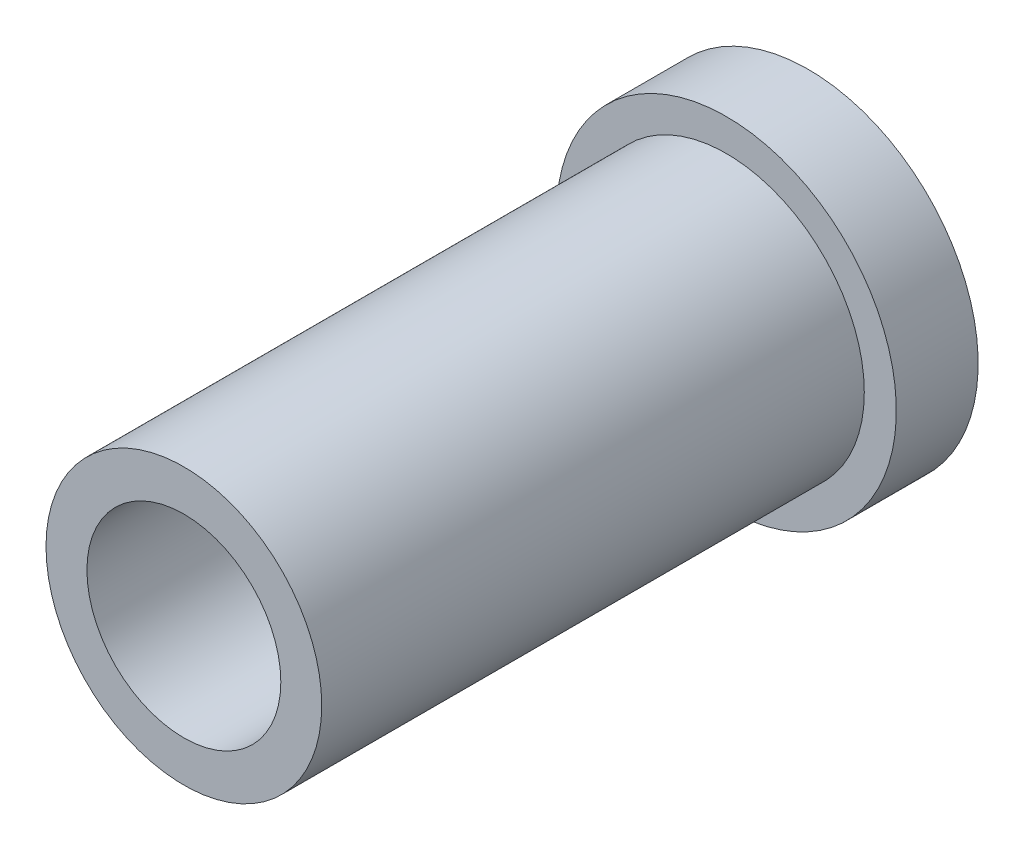
ISO-10303-21;
HEADER;
FILE_DESCRIPTION(('STEP AP214'),'2;1');
FILE_NAME('part.step','',(''),(''),'','','');
FILE_SCHEMA(('AUTOMOTIVE_DESIGN { 1 0 10303 214 1 1 1 1 }'));
ENDSEC;
DATA;
#1=APPLICATION_CONTEXT('core data for automotive mechanical design processes');
#2=APPLICATION_PROTOCOL_DEFINITION('international standard','automotive_design',2000,#1);
#3=PRODUCT_CONTEXT('',#1,'mechanical');
#4=PRODUCT('Part','Part','',(#3));
#5=PRODUCT_RELATED_PRODUCT_CATEGORY('part','',(#4));
#6=PRODUCT_DEFINITION_FORMATION('','',#4);
#7=PRODUCT_DEFINITION_CONTEXT('part definition',#1,'design');
#8=PRODUCT_DEFINITION('design','',#6,#7);
#9=PRODUCT_DEFINITION_SHAPE('','',#8);
#10=(LENGTH_UNIT() NAMED_UNIT(*) SI_UNIT(.MILLI.,.METRE.));
#11=(NAMED_UNIT(*) PLANE_ANGLE_UNIT() SI_UNIT($,.RADIAN.));
#12=(NAMED_UNIT(*) SI_UNIT($,.STERADIAN.) SOLID_ANGLE_UNIT());
#13=UNCERTAINTY_MEASURE_WITH_UNIT(LENGTH_MEASURE(1.E-05),#10,'distance_accuracy_value','');
#14=(GEOMETRIC_REPRESENTATION_CONTEXT(3) GLOBAL_UNCERTAINTY_ASSIGNED_CONTEXT((#13)) GLOBAL_UNIT_ASSIGNED_CONTEXT((#10,
#11,#12)) REPRESENTATION_CONTEXT('',''));
#15=CARTESIAN_POINT('',(0.,0.,0.));
#16=DIRECTION('',(0.,0.,1.));
#17=DIRECTION('',(1.,0.,0.));
#18=AXIS2_PLACEMENT_3D('',#15,#16,#17);
#19=CARTESIAN_POINT('',(0.,0.,-0.460000000000002));
#20=DIRECTION('',(0.,0.,-1.));
#21=DIRECTION('',(-1.,0.,0.));
#22=AXIS2_PLACEMENT_3D('',#19,#20,#21);
#23=CYLINDRICAL_SURFACE('',#22,0.545000000000001);
#24=CARTESIAN_POINT('',(0.,0.,-0.460000000000003));
#25=DIRECTION('',(0.,0.,-1.));
#26=DIRECTION('',(-1.,0.,0.));
#27=AXIS2_PLACEMENT_3D('',#24,#25,#26);
#28=CIRCLE('',#27,0.545000000000002);
#29=CARTESIAN_POINT('',(-0.545,0.,-0.460000000000003));
#30=VERTEX_POINT('',#29);
#31=EDGE_CURVE('E10',#30,#30,#28,.T.);
#32=ORIENTED_EDGE('',*,*,#31,.T.);
#33=EDGE_LOOP('',(#32));
#34=FACE_BOUND('',#33,.T.);
#35=CARTESIAN_POINT('',(0.,0.,3.05));
#36=DIRECTION('',(0.,0.,-1.));
#37=DIRECTION('',(-1.,0.,0.));
#38=AXIS2_PLACEMENT_3D('',#35,#36,#37);
#39=CIRCLE('',#38,0.545000000000001);
#40=CARTESIAN_POINT('',(-0.545,0.,3.05));
#41=VERTEX_POINT('',#40);
#42=EDGE_CURVE('E53',#41,#41,#39,.T.);
#43=ORIENTED_EDGE('',*,*,#42,.F.);
#44=EDGE_LOOP('',(#43));
#45=FACE_BOUND('',#44,.T.);
#46=ADVANCED_FACE('F31',(#34,#45),#23,.F.);
#47=CARTESIAN_POINT('',(-0.545,0.,-0.460000000000001));
#48=DIRECTION('',(0.,0.,-1.));
#49=DIRECTION('',(-1.,0.,0.));
#50=AXIS2_PLACEMENT_3D('',#47,#48,#49);
#51=PLANE('',#50);
#52=CARTESIAN_POINT('',(0.,0.,-0.46));
#53=DIRECTION('',(0.,0.,-1.));
#54=DIRECTION('',(-1.,0.,0.));
#55=AXIS2_PLACEMENT_3D('',#52,#53,#54);
#56=CIRCLE('',#55,0.955000000000003);
#57=CARTESIAN_POINT('',(-0.955000000000001,0.,-0.46));
#58=VERTEX_POINT('',#57);
#59=EDGE_CURVE('E37',#58,#58,#56,.T.);
#60=ORIENTED_EDGE('',*,*,#59,.T.);
#61=EDGE_LOOP('',(#60));
#62=FACE_BOUND('',#61,.T.);
#63=ORIENTED_EDGE('',*,*,#31,.F.);
#64=EDGE_LOOP('',(#63));
#65=FACE_BOUND('',#64,.T.);
#66=ADVANCED_FACE('F61',(#62,#65),#51,.T.);
#67=CARTESIAN_POINT('',(0.,0.,-0.460000000000002));
#68=DIRECTION('',(0.,0.,-1.));
#69=DIRECTION('',(-1.,0.,0.));
#70=AXIS2_PLACEMENT_3D('',#67,#68,#69);
#71=CYLINDRICAL_SURFACE('',#70,0.955000000000003);
#72=CARTESIAN_POINT('',(0.,0.,0.));
#73=DIRECTION('',(0.,0.,-1.));
#74=DIRECTION('',(-1.,0.,0.));
#75=AXIS2_PLACEMENT_3D('',#72,#73,#74);
#76=CIRCLE('',#75,0.955000000000003);
#77=CARTESIAN_POINT('',(-0.955000000000001,0.,0.));
#78=VERTEX_POINT('',#77);
#79=EDGE_CURVE('E41',#78,#78,#76,.T.);
#80=ORIENTED_EDGE('',*,*,#79,.T.);
#81=EDGE_LOOP('',(#80));
#82=FACE_BOUND('',#81,.T.);
#83=ORIENTED_EDGE('',*,*,#59,.F.);
#84=EDGE_LOOP('',(#83));
#85=FACE_BOUND('',#84,.T.);
#86=ADVANCED_FACE('F65',(#82,#85),#71,.T.);
#87=CARTESIAN_POINT('',(-0.955000000000001,0.,0.));
#88=DIRECTION('',(0.,0.,1.));
#89=DIRECTION('',(1.,0.,0.));
#90=AXIS2_PLACEMENT_3D('',#87,#88,#89);
#91=PLANE('',#90);
#92=CARTESIAN_POINT('',(0.,0.,0.));
#93=DIRECTION('',(0.,0.,-1.));
#94=DIRECTION('',(-1.,0.,0.));
#95=AXIS2_PLACEMENT_3D('',#92,#93,#94);
#96=CIRCLE('',#95,0.775000000000003);
#97=CARTESIAN_POINT('',(-0.775000000000001,0.,0.));
#98=VERTEX_POINT('',#97);
#99=EDGE_CURVE('E45',#98,#98,#96,.T.);
#100=ORIENTED_EDGE('',*,*,#99,.T.);
#101=EDGE_LOOP('',(#100));
#102=FACE_BOUND('',#101,.T.);
#103=ORIENTED_EDGE('',*,*,#79,.F.);
#104=EDGE_LOOP('',(#103));
#105=FACE_BOUND('',#104,.T.);
#106=ADVANCED_FACE('F69',(#102,#105),#91,.T.);
#107=CARTESIAN_POINT('',(0.,0.,-0.460000000000002));
#108=DIRECTION('',(0.,0.,-1.));
#109=DIRECTION('',(-1.,0.,0.));
#110=AXIS2_PLACEMENT_3D('',#107,#108,#109);
#111=CYLINDRICAL_SURFACE('',#110,0.775000000000002);
#112=CARTESIAN_POINT('',(0.,0.,3.05));
#113=DIRECTION('',(0.,0.,-1.));
#114=DIRECTION('',(-1.,0.,0.));
#115=AXIS2_PLACEMENT_3D('',#112,#113,#114);
#116=CIRCLE('',#115,0.775000000000002);
#117=CARTESIAN_POINT('',(-0.775000000000001,0.,3.05));
#118=VERTEX_POINT('',#117);
#119=EDGE_CURVE('E50',#118,#118,#116,.T.);
#120=ORIENTED_EDGE('',*,*,#119,.T.);
#121=EDGE_LOOP('',(#120));
#122=FACE_BOUND('',#121,.T.);
#123=ORIENTED_EDGE('',*,*,#99,.F.);
#124=EDGE_LOOP('',(#123));
#125=FACE_BOUND('',#124,.T.);
#126=ADVANCED_FACE('F76',(#122,#125),#111,.T.);
#127=CARTESIAN_POINT('',(-0.775000000000001,0.,3.05));
#128=DIRECTION('',(0.,0.,1.));
#129=DIRECTION('',(1.,0.,0.));
#130=AXIS2_PLACEMENT_3D('',#127,#128,#129);
#131=PLANE('',#130);
#132=ORIENTED_EDGE('',*,*,#42,.T.);
#133=EDGE_LOOP('',(#132));
#134=FACE_BOUND('',#133,.T.);
#135=ORIENTED_EDGE('',*,*,#119,.F.);
#136=EDGE_LOOP('',(#135));
#137=FACE_BOUND('',#136,.T.);
#138=ADVANCED_FACE('F57',(#134,#137),#131,.T.);
#139=CLOSED_SHELL('',(#46,#66,#86,#106,#126,#138));
#140=MANIFOLD_SOLID_BREP('B2',#139);
#141=ADVANCED_BREP_SHAPE_REPRESENTATION('',(#18,#140),#14);
#142=SHAPE_DEFINITION_REPRESENTATION(#9,#141);
ENDSEC;
END-ISO-10303-21;
